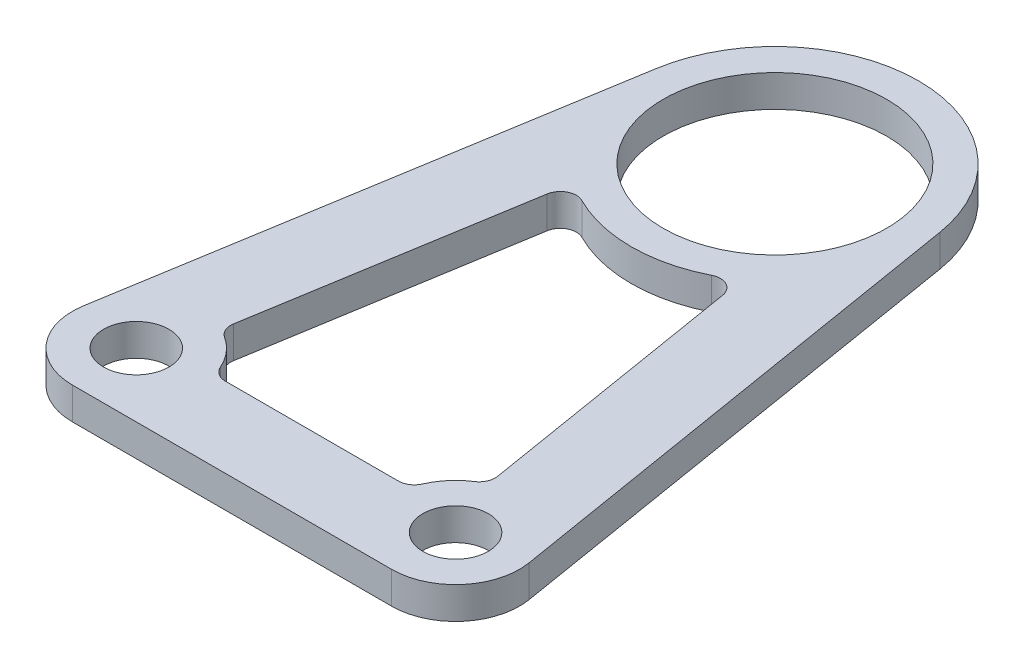
ISO-10303-21;
HEADER;
FILE_DESCRIPTION(('STEP AP214'),'2;1');
FILE_NAME('part.step','',(''),(''),'','','');
FILE_SCHEMA(('AUTOMOTIVE_DESIGN { 1 0 10303 214 1 1 1 1 }'));
ENDSEC;
DATA;
#1=APPLICATION_CONTEXT('core data for automotive mechanical design processes');
#2=APPLICATION_PROTOCOL_DEFINITION('international standard','automotive_design',2000,#1);
#3=PRODUCT_CONTEXT('',#1,'mechanical');
#4=PRODUCT('Part','Part','',(#3));
#5=PRODUCT_RELATED_PRODUCT_CATEGORY('part','',(#4));
#6=PRODUCT_DEFINITION_FORMATION('','',#4);
#7=PRODUCT_DEFINITION_CONTEXT('part definition',#1,'design');
#8=PRODUCT_DEFINITION('design','',#6,#7);
#9=PRODUCT_DEFINITION_SHAPE('','',#8);
#10=(LENGTH_UNIT() NAMED_UNIT(*) SI_UNIT(.MILLI.,.METRE.));
#11=(NAMED_UNIT(*) PLANE_ANGLE_UNIT() SI_UNIT($,.RADIAN.));
#12=(NAMED_UNIT(*) SI_UNIT($,.STERADIAN.) SOLID_ANGLE_UNIT());
#13=UNCERTAINTY_MEASURE_WITH_UNIT(LENGTH_MEASURE(1.E-05),#10,'distance_accuracy_value','');
#14=(GEOMETRIC_REPRESENTATION_CONTEXT(3) GLOBAL_UNCERTAINTY_ASSIGNED_CONTEXT((#13)) GLOBAL_UNIT_ASSIGNED_CONTEXT((#10,
#11,#12)) REPRESENTATION_CONTEXT('',''));
#15=CARTESIAN_POINT('',(0.,0.,0.));
#16=DIRECTION('',(0.,0.,1.));
#17=DIRECTION('',(1.,0.,0.));
#18=AXIS2_PLACEMENT_3D('',#15,#16,#17);
#19=CARTESIAN_POINT('',(0.,2.,0.));
#20=DIRECTION('',(0.,1.,0.));
#21=DIRECTION('',(0.,0.,1.));
#22=AXIS2_PLACEMENT_3D('',#19,#20,#21);
#23=PLANE('',#22);
#24=CARTESIAN_POINT('',(-10.,2.,30.));
#25=DIRECTION('',(0.,1.,0.));
#26=DIRECTION('',(0.,0.,1.));
#27=AXIS2_PLACEMENT_3D('',#24,#25,#26);
#28=CIRCLE('',#27,2.05);
#29=CARTESIAN_POINT('',(-10.,2.,32.05));
#30=VERTEX_POINT('',#29);
#31=EDGE_CURVE('E225',#30,#30,#28,.T.);
#32=ORIENTED_EDGE('',*,*,#31,.F.);
#33=EDGE_LOOP('',(#32));
#34=FACE_BOUND('',#33,.T.);
#35=CARTESIAN_POINT('',(0.,2.,0.));
#36=DIRECTION('',(0.,1.,0.));
#37=DIRECTION('',(0.,0.,1.));
#38=AXIS2_PLACEMENT_3D('',#35,#36,#37);
#39=CIRCLE('',#38,9.);
#40=CARTESIAN_POINT('',(8.88074729783784,2.,-1.46024909927928));
#41=VERTEX_POINT('',#40);
#42=CARTESIAN_POINT('',(-8.88074729783784,2.,-1.46024909927928));
#43=VERTEX_POINT('',#42);
#44=EDGE_CURVE('E305',#41,#43,#39,.T.);
#45=ORIENTED_EDGE('',*,*,#44,.T.);
#46=DIRECTION('',(-0.16224989991992,0.,0.98674969975976));
#47=VECTOR('',#46,1.);
#48=CARTESIAN_POINT('',(-8.88074729783784,2.,-1.46024909927928));
#49=LINE('',#48,#47);
#50=CARTESIAN_POINT('',(-13.946998799039,2.,29.3510004003203));
#51=VERTEX_POINT('',#50);
#52=EDGE_CURVE('E309',#43,#51,#49,.T.);
#53=ORIENTED_EDGE('',*,*,#52,.T.);
#54=CARTESIAN_POINT('',(-10.,2.,30.));
#55=DIRECTION('',(0.,1.,0.));
#56=DIRECTION('',(0.,0.,1.));
#57=AXIS2_PLACEMENT_3D('',#54,#55,#56);
#58=CIRCLE('',#57,4.);
#59=CARTESIAN_POINT('',(-10.,2.,34.));
#60=VERTEX_POINT('',#59);
#61=EDGE_CURVE('E313',#51,#60,#58,.T.);
#62=ORIENTED_EDGE('',*,*,#61,.T.);
#63=DIRECTION('',(1.,0.,0.));
#64=VECTOR('',#63,1.);
#65=CARTESIAN_POINT('',(-10.,2.,34.));
#66=LINE('',#65,#64);
#67=CARTESIAN_POINT('',(10.,2.,34.));
#68=VERTEX_POINT('',#67);
#69=EDGE_CURVE('E316',#60,#68,#66,.T.);
#70=ORIENTED_EDGE('',*,*,#69,.T.);
#71=CARTESIAN_POINT('',(10.,2.,30.));
#72=DIRECTION('',(0.,1.,0.));
#73=DIRECTION('',(0.,0.,-1.));
#74=AXIS2_PLACEMENT_3D('',#71,#72,#73);
#75=CIRCLE('',#74,4.);
#76=CARTESIAN_POINT('',(13.946998799039,2.,29.3510004003203));
#77=VERTEX_POINT('',#76);
#78=EDGE_CURVE('E319',#68,#77,#75,.T.);
#79=ORIENTED_EDGE('',*,*,#78,.T.);
#80=DIRECTION('',(-0.16224989991992,0.,-0.98674969975976));
#81=VECTOR('',#80,1.);
#82=CARTESIAN_POINT('',(8.88074729783784,2.,-1.46024909927928));
#83=LINE('',#82,#81);
#84=EDGE_CURVE('E322',#77,#41,#83,.T.);
#85=ORIENTED_EDGE('',*,*,#84,.T.);
#86=EDGE_LOOP('',(#45,#53,#62,#70,#79,#85));
#87=FACE_BOUND('',#86,.T.);
#88=CARTESIAN_POINT('',(0.,2.,0.));
#89=DIRECTION('',(0.,1.,0.));
#90=DIRECTION('',(0.,0.,1.));
#91=AXIS2_PLACEMENT_3D('',#88,#89,#90);
#92=CIRCLE('',#91,7.);
#93=CARTESIAN_POINT('',(0.,2.,7.));
#94=VERTEX_POINT('',#93);
#95=EDGE_CURVE('E297',#94,#94,#92,.T.);
#96=ORIENTED_EDGE('',*,*,#95,.F.);
#97=EDGE_LOOP('',(#96));
#98=FACE_BOUND('',#97,.T.);
#99=CARTESIAN_POINT('',(-10.,2.,30.));
#100=DIRECTION('',(0.,-1.,0.));
#101=DIRECTION('',(0.,0.,1.));
#102=AXIS2_PLACEMENT_3D('',#99,#100,#101);
#103=CIRCLE('',#102,4.);
#104=CARTESIAN_POINT('',(-7.82638252207875,2.,26.6421156869726));
#105=VERTEX_POINT('',#104);
#106=CARTESIAN_POINT('',(-6.33393944403533,2.,28.4));
#107=VERTEX_POINT('',#106);
#108=EDGE_CURVE('E174',#105,#107,#103,.T.);
#109=ORIENTED_EDGE('',*,*,#108,.F.);
#110=CARTESIAN_POINT('',(-7.28297815259844,2.,25.8026446087158));
#111=DIRECTION('',(0.,1.,0.));
#112=DIRECTION('',(0.,0.,1.));
#113=AXIS2_PLACEMENT_3D('',#110,#111,#112);
#114=CIRCLE('',#113,1.);
#115=CARTESIAN_POINT('',(-8.2697278523582,2.,25.6403947087959));
#116=VERTEX_POINT('',#115);
#117=EDGE_CURVE('E165',#116,#105,#114,.T.);
#118=ORIENTED_EDGE('',*,*,#117,.F.);
#119=DIRECTION('',(-0.16224989991992,0.,0.98674969975976));
#120=VECTOR('',#119,1.);
#121=CARTESIAN_POINT('',(-5.49476419863492,2.,8.76399260619268));
#122=LINE('',#121,#120);
#123=CARTESIAN_POINT('',(-5.49476419863492,2.,8.76399260619268));
#124=VERTEX_POINT('',#123);
#125=EDGE_CURVE('E220',#124,#116,#122,.T.);
#126=ORIENTED_EDGE('',*,*,#125,.F.);
#127=CARTESIAN_POINT('',(-4.50801449887516,2.,8.9262425061126));
#128=DIRECTION('',(0.,1.,0.));
#129=DIRECTION('',(0.,0.,-1.));
#130=AXIS2_PLACEMENT_3D('',#127,#128,#129);
#131=CIRCLE('',#130,1.);
#132=CARTESIAN_POINT('',(-4.05721304898764,2.,8.03361825550134));
#133=VERTEX_POINT('',#132);
#134=EDGE_CURVE('E217',#133,#124,#131,.T.);
#135=ORIENTED_EDGE('',*,*,#134,.F.);
#136=CARTESIAN_POINT('',(0.,2.,0.));
#137=DIRECTION('',(0.,-1.,0.));
#138=DIRECTION('',(0.,0.,1.));
#139=AXIS2_PLACEMENT_3D('',#136,#137,#138);
#140=CIRCLE('',#139,9.);
#141=CARTESIAN_POINT('',(4.05721304898764,2.,8.03361825550134));
#142=VERTEX_POINT('',#141);
#143=EDGE_CURVE('E214',#142,#133,#140,.T.);
#144=ORIENTED_EDGE('',*,*,#143,.F.);
#145=CARTESIAN_POINT('',(4.50801449887516,2.,8.9262425061126));
#146=DIRECTION('',(0.,1.,0.));
#147=DIRECTION('',(0.,0.,1.));
#148=AXIS2_PLACEMENT_3D('',#145,#146,#147);
#149=CIRCLE('',#148,0.999999999999999);
#150=CARTESIAN_POINT('',(5.49476419863492,2.,8.76399260619268));
#151=VERTEX_POINT('',#150);
#152=EDGE_CURVE('E211',#151,#142,#149,.T.);
#153=ORIENTED_EDGE('',*,*,#152,.F.);
#154=DIRECTION('',(-0.16224989991992,0.,-0.98674969975976));
#155=VECTOR('',#154,1.);
#156=CARTESIAN_POINT('',(5.49476419863492,2.,8.76399260619268));
#157=LINE('',#156,#155);
#158=CARTESIAN_POINT('',(8.2697278523582,2.,25.6403947087959));
#159=VERTEX_POINT('',#158);
#160=EDGE_CURVE('E208',#159,#151,#157,.T.);
#161=ORIENTED_EDGE('',*,*,#160,.F.);
#162=CARTESIAN_POINT('',(7.28297815259844,2.,25.8026446087158));
#163=DIRECTION('',(0.,1.,0.));
#164=DIRECTION('',(0.,0.,-1.));
#165=AXIS2_PLACEMENT_3D('',#162,#163,#164);
#166=CIRCLE('',#165,1.);
#167=CARTESIAN_POINT('',(7.82638252207876,2.,26.6421156869726));
#168=VERTEX_POINT('',#167);
#169=EDGE_CURVE('E205',#168,#159,#166,.T.);
#170=ORIENTED_EDGE('',*,*,#169,.F.);
#171=CARTESIAN_POINT('',(10.,2.,30.));
#172=DIRECTION('',(0.,-1.,0.));
#173=DIRECTION('',(0.,0.,-1.));
#174=AXIS2_PLACEMENT_3D('',#171,#172,#173);
#175=CIRCLE('',#174,4.);
#176=CARTESIAN_POINT('',(6.33393944403534,2.,28.4));
#177=VERTEX_POINT('',#176);
#178=EDGE_CURVE('E202',#177,#168,#175,.T.);
#179=ORIENTED_EDGE('',*,*,#178,.F.);
#180=CARTESIAN_POINT('',(5.41742430504417,2.,28.));
#181=DIRECTION('',(0.,1.,0.));
#182=DIRECTION('',(0.,0.,1.));
#183=AXIS2_PLACEMENT_3D('',#180,#181,#182);
#184=CIRCLE('',#183,1.);
#185=CARTESIAN_POINT('',(5.41742430504417,2.,29.));
#186=VERTEX_POINT('',#185);
#187=EDGE_CURVE('E199',#186,#177,#184,.T.);
#188=ORIENTED_EDGE('',*,*,#187,.F.);
#189=DIRECTION('',(1.,0.,0.));
#190=VECTOR('',#189,1.);
#191=CARTESIAN_POINT('',(-5.41742430504416,2.,29.));
#192=LINE('',#191,#190);
#193=CARTESIAN_POINT('',(-5.41742430504416,2.,29.));
#194=VERTEX_POINT('',#193);
#195=EDGE_CURVE('E193',#194,#186,#192,.T.);
#196=ORIENTED_EDGE('',*,*,#195,.F.);
#197=CARTESIAN_POINT('',(-5.41742430504416,2.,28.));
#198=DIRECTION('',(0.,1.,0.));
#199=DIRECTION('',(0.,0.,-1.));
#200=AXIS2_PLACEMENT_3D('',#197,#198,#199);
#201=CIRCLE('',#200,1.);
#202=EDGE_CURVE('E189',#107,#194,#201,.T.);
#203=ORIENTED_EDGE('',*,*,#202,.F.);
#204=EDGE_LOOP('',(#109,#118,#126,#135,#144,#153,#161,#170,#179,#188,#196,#203));
#205=FACE_BOUND('',#204,.T.);
#206=CARTESIAN_POINT('',(10.,2.,30.));
#207=DIRECTION('',(0.,1.,0.));
#208=DIRECTION('',(0.,0.,-1.));
#209=AXIS2_PLACEMENT_3D('',#206,#207,#208);
#210=CIRCLE('',#209,2.05);
#211=CARTESIAN_POINT('',(10.,2.,27.95));
#212=VERTEX_POINT('',#211);
#213=EDGE_CURVE('E466',#212,#212,#210,.T.);
#214=ORIENTED_EDGE('',*,*,#213,.F.);
#215=EDGE_LOOP('',(#214));
#216=FACE_BOUND('',#215,.T.);
#217=ADVANCED_FACE('F39',(#34,#87,#98,#205,#216),#23,.T.);
#218=CARTESIAN_POINT('',(0.,0.,0.));
#219=DIRECTION('',(0.,1.,0.));
#220=DIRECTION('',(0.,0.,1.));
#221=AXIS2_PLACEMENT_3D('',#218,#219,#220);
#222=PLANE('',#221);
#223=CARTESIAN_POINT('',(0.,0.,0.));
#224=DIRECTION('',(0.,1.,0.));
#225=DIRECTION('',(0.,0.,1.));
#226=AXIS2_PLACEMENT_3D('',#223,#224,#225);
#227=CIRCLE('',#226,7.);
#228=CARTESIAN_POINT('',(0.,0.,7.));
#229=VERTEX_POINT('',#228);
#230=EDGE_CURVE('E183',#229,#229,#227,.T.);
#231=ORIENTED_EDGE('',*,*,#230,.T.);
#232=EDGE_LOOP('',(#231));
#233=FACE_BOUND('',#232,.T.);
#234=CARTESIAN_POINT('',(0.,0.,0.));
#235=DIRECTION('',(0.,1.,0.));
#236=DIRECTION('',(0.,0.,1.));
#237=AXIS2_PLACEMENT_3D('',#234,#235,#236);
#238=CIRCLE('',#237,9.);
#239=CARTESIAN_POINT('',(8.88074729783784,0.,-1.46024909927928));
#240=VERTEX_POINT('',#239);
#241=CARTESIAN_POINT('',(-8.88074729783784,0.,-1.46024909927928));
#242=VERTEX_POINT('',#241);
#243=EDGE_CURVE('E301',#240,#242,#238,.T.);
#244=ORIENTED_EDGE('',*,*,#243,.F.);
#245=DIRECTION('',(-0.16224989991992,0.,-0.98674969975976));
#246=VECTOR('',#245,1.);
#247=CARTESIAN_POINT('',(8.88074729783784,0.,-1.46024909927928));
#248=LINE('',#247,#246);
#249=CARTESIAN_POINT('',(13.946998799039,0.,29.3510004003203));
#250=VERTEX_POINT('',#249);
#251=EDGE_CURVE('E310',#250,#240,#248,.T.);
#252=ORIENTED_EDGE('',*,*,#251,.F.);
#253=CARTESIAN_POINT('',(10.,0.,30.));
#254=DIRECTION('',(0.,1.,0.));
#255=DIRECTION('',(0.,0.,-1.));
#256=AXIS2_PLACEMENT_3D('',#253,#254,#255);
#257=CIRCLE('',#256,4.);
#258=CARTESIAN_POINT('',(10.,0.,34.));
#259=VERTEX_POINT('',#258);
#260=EDGE_CURVE('E338',#259,#250,#257,.T.);
#261=ORIENTED_EDGE('',*,*,#260,.F.);
#262=DIRECTION('',(1.,0.,0.));
#263=VECTOR('',#262,1.);
#264=CARTESIAN_POINT('',(-10.,0.,34.));
#265=LINE('',#264,#263);
#266=CARTESIAN_POINT('',(-10.,0.,34.));
#267=VERTEX_POINT('',#266);
#268=EDGE_CURVE('E335',#267,#259,#265,.T.);
#269=ORIENTED_EDGE('',*,*,#268,.F.);
#270=CARTESIAN_POINT('',(-10.,0.,30.));
#271=DIRECTION('',(0.,1.,0.));
#272=DIRECTION('',(0.,0.,1.));
#273=AXIS2_PLACEMENT_3D('',#270,#271,#272);
#274=CIRCLE('',#273,4.);
#275=CARTESIAN_POINT('',(-13.946998799039,0.,29.3510004003203));
#276=VERTEX_POINT('',#275);
#277=EDGE_CURVE('E332',#276,#267,#274,.T.);
#278=ORIENTED_EDGE('',*,*,#277,.F.);
#279=DIRECTION('',(-0.16224989991992,0.,0.98674969975976));
#280=VECTOR('',#279,1.);
#281=CARTESIAN_POINT('',(-8.88074729783784,0.,-1.46024909927928));
#282=LINE('',#281,#280);
#283=EDGE_CURVE('E329',#242,#276,#282,.T.);
#284=ORIENTED_EDGE('',*,*,#283,.F.);
#285=EDGE_LOOP('',(#244,#252,#261,#269,#278,#284));
#286=FACE_BOUND('',#285,.T.);
#287=CARTESIAN_POINT('',(-7.28297815259844,0.,25.8026446087158));
#288=DIRECTION('',(0.,1.,0.));
#289=DIRECTION('',(0.,0.,1.));
#290=AXIS2_PLACEMENT_3D('',#287,#288,#289);
#291=CIRCLE('',#290,1.);
#292=CARTESIAN_POINT('',(-8.2697278523582,0.,25.6403947087959));
#293=VERTEX_POINT('',#292);
#294=CARTESIAN_POINT('',(-7.82638252207875,0.,26.6421156869726));
#295=VERTEX_POINT('',#294);
#296=EDGE_CURVE('E63',#293,#295,#291,.T.);
#297=ORIENTED_EDGE('',*,*,#296,.T.);
#298=CARTESIAN_POINT('',(-10.,0.,30.));
#299=DIRECTION('',(0.,-1.,0.));
#300=DIRECTION('',(0.,0.,1.));
#301=AXIS2_PLACEMENT_3D('',#298,#299,#300);
#302=CIRCLE('',#301,4.);
#303=CARTESIAN_POINT('',(-6.33393944403533,0.,28.4));
#304=VERTEX_POINT('',#303);
#305=EDGE_CURVE('E181',#295,#304,#302,.T.);
#306=ORIENTED_EDGE('',*,*,#305,.T.);
#307=CARTESIAN_POINT('',(-5.41742430504416,0.,28.));
#308=DIRECTION('',(0.,1.,0.));
#309=DIRECTION('',(0.,0.,-1.));
#310=AXIS2_PLACEMENT_3D('',#307,#308,#309);
#311=CIRCLE('',#310,1.);
#312=CARTESIAN_POINT('',(-5.41742430504416,0.,29.));
#313=VERTEX_POINT('',#312);
#314=EDGE_CURVE('E228',#304,#313,#311,.T.);
#315=ORIENTED_EDGE('',*,*,#314,.T.);
#316=DIRECTION('',(1.,0.,0.));
#317=VECTOR('',#316,1.);
#318=CARTESIAN_POINT('',(-5.41742430504416,0.,29.));
#319=LINE('',#318,#317);
#320=CARTESIAN_POINT('',(5.41742430504417,0.,29.));
#321=VERTEX_POINT('',#320);
#322=EDGE_CURVE('E232',#313,#321,#319,.T.);
#323=ORIENTED_EDGE('',*,*,#322,.T.);
#324=CARTESIAN_POINT('',(5.41742430504417,0.,28.));
#325=DIRECTION('',(0.,1.,0.));
#326=DIRECTION('',(0.,0.,1.));
#327=AXIS2_PLACEMENT_3D('',#324,#325,#326);
#328=CIRCLE('',#327,1.);
#329=CARTESIAN_POINT('',(6.33393944403534,0.,28.4));
#330=VERTEX_POINT('',#329);
#331=EDGE_CURVE('E236',#321,#330,#328,.T.);
#332=ORIENTED_EDGE('',*,*,#331,.T.);
#333=CARTESIAN_POINT('',(10.,0.,30.));
#334=DIRECTION('',(0.,-1.,0.));
#335=DIRECTION('',(0.,0.,-1.));
#336=AXIS2_PLACEMENT_3D('',#333,#334,#335);
#337=CIRCLE('',#336,4.);
#338=CARTESIAN_POINT('',(7.82638252207876,0.,26.6421156869726));
#339=VERTEX_POINT('',#338);
#340=EDGE_CURVE('E240',#330,#339,#337,.T.);
#341=ORIENTED_EDGE('',*,*,#340,.T.);
#342=CARTESIAN_POINT('',(7.28297815259844,0.,25.8026446087158));
#343=DIRECTION('',(0.,1.,0.));
#344=DIRECTION('',(0.,0.,-1.));
#345=AXIS2_PLACEMENT_3D('',#342,#343,#344);
#346=CIRCLE('',#345,1.);
#347=CARTESIAN_POINT('',(8.2697278523582,0.,25.6403947087959));
#348=VERTEX_POINT('',#347);
#349=EDGE_CURVE('E244',#339,#348,#346,.T.);
#350=ORIENTED_EDGE('',*,*,#349,.T.);
#351=DIRECTION('',(-0.16224989991992,0.,-0.98674969975976));
#352=VECTOR('',#351,1.);
#353=CARTESIAN_POINT('',(5.49476419863492,0.,8.76399260619268));
#354=LINE('',#353,#352);
#355=CARTESIAN_POINT('',(5.49476419863492,0.,8.76399260619268));
#356=VERTEX_POINT('',#355);
#357=EDGE_CURVE('E248',#348,#356,#354,.T.);
#358=ORIENTED_EDGE('',*,*,#357,.T.);
#359=CARTESIAN_POINT('',(4.50801449887516,0.,8.9262425061126));
#360=DIRECTION('',(0.,1.,0.));
#361=DIRECTION('',(0.,0.,1.));
#362=AXIS2_PLACEMENT_3D('',#359,#360,#361);
#363=CIRCLE('',#362,0.999999999999999);
#364=CARTESIAN_POINT('',(4.05721304898764,0.,8.03361825550134));
#365=VERTEX_POINT('',#364);
#366=EDGE_CURVE('E252',#356,#365,#363,.T.);
#367=ORIENTED_EDGE('',*,*,#366,.T.);
#368=CARTESIAN_POINT('',(0.,0.,0.));
#369=DIRECTION('',(0.,-1.,0.));
#370=DIRECTION('',(0.,0.,1.));
#371=AXIS2_PLACEMENT_3D('',#368,#369,#370);
#372=CIRCLE('',#371,9.);
#373=CARTESIAN_POINT('',(-4.05721304898764,0.,8.03361825550134));
#374=VERTEX_POINT('',#373);
#375=EDGE_CURVE('E256',#365,#374,#372,.T.);
#376=ORIENTED_EDGE('',*,*,#375,.T.);
#377=CARTESIAN_POINT('',(-4.50801449887516,0.,8.9262425061126));
#378=DIRECTION('',(0.,1.,0.));
#379=DIRECTION('',(0.,0.,-1.));
#380=AXIS2_PLACEMENT_3D('',#377,#378,#379);
#381=CIRCLE('',#380,1.);
#382=CARTESIAN_POINT('',(-5.49476419863492,0.,8.76399260619268));
#383=VERTEX_POINT('',#382);
#384=EDGE_CURVE('E260',#374,#383,#381,.T.);
#385=ORIENTED_EDGE('',*,*,#384,.T.);
#386=DIRECTION('',(-0.16224989991992,0.,0.98674969975976));
#387=VECTOR('',#386,1.);
#388=CARTESIAN_POINT('',(-5.49476419863492,0.,8.76399260619268));
#389=LINE('',#388,#387);
#390=EDGE_CURVE('E175',#383,#293,#389,.T.);
#391=ORIENTED_EDGE('',*,*,#390,.T.);
#392=EDGE_LOOP('',(#297,#306,#315,#323,#332,#341,#350,#358,#367,#376,#385,#391));
#393=FACE_BOUND('',#392,.T.);
#394=CARTESIAN_POINT('',(-10.,0.,30.));
#395=DIRECTION('',(0.,1.,0.));
#396=DIRECTION('',(0.,0.,1.));
#397=AXIS2_PLACEMENT_3D('',#394,#395,#396);
#398=CIRCLE('',#397,2.05);
#399=CARTESIAN_POINT('',(-10.,0.,32.05));
#400=VERTEX_POINT('',#399);
#401=EDGE_CURVE('E474',#400,#400,#398,.T.);
#402=ORIENTED_EDGE('',*,*,#401,.T.);
#403=EDGE_LOOP('',(#402));
#404=FACE_BOUND('',#403,.T.);
#405=CARTESIAN_POINT('',(10.,0.,30.));
#406=DIRECTION('',(0.,1.,0.));
#407=DIRECTION('',(0.,0.,-1.));
#408=AXIS2_PLACEMENT_3D('',#405,#406,#407);
#409=CIRCLE('',#408,2.05);
#410=CARTESIAN_POINT('',(10.,0.,27.95));
#411=VERTEX_POINT('',#410);
#412=EDGE_CURVE('E469',#411,#411,#409,.T.);
#413=ORIENTED_EDGE('',*,*,#412,.T.);
#414=EDGE_LOOP('',(#413));
#415=FACE_BOUND('',#414,.T.);
#416=ADVANCED_FACE('F369',(#233,#286,#393,#404,#415),#222,.F.);
#417=CARTESIAN_POINT('',(0.,2.,0.));
#418=DIRECTION('',(0.,-1.,0.));
#419=DIRECTION('',(0.,0.,-1.));
#420=AXIS2_PLACEMENT_3D('',#417,#418,#419);
#421=CYLINDRICAL_SURFACE('',#420,9.);
#422=ORIENTED_EDGE('',*,*,#243,.T.);
#423=DIRECTION('',(0.,-1.,0.));
#424=VECTOR('',#423,1.);
#425=CARTESIAN_POINT('',(-8.88074729783784,2.,-1.46024909927928));
#426=LINE('',#425,#424);
#427=EDGE_CURVE('E11',#43,#242,#426,.T.);
#428=ORIENTED_EDGE('',*,*,#427,.F.);
#429=ORIENTED_EDGE('',*,*,#44,.F.);
#430=DIRECTION('',(0.,-1.,0.));
#431=VECTOR('',#430,1.);
#432=CARTESIAN_POINT('',(8.88074729783784,2.,-1.46024909927928));
#433=LINE('',#432,#431);
#434=EDGE_CURVE('E325',#41,#240,#433,.T.);
#435=ORIENTED_EDGE('',*,*,#434,.T.);
#436=EDGE_LOOP('',(#422,#428,#429,#435));
#437=FACE_BOUND('',#436,.T.);
#438=ADVANCED_FACE('F41',(#437),#421,.T.);
#439=CARTESIAN_POINT('',(-8.88074729783784,2.,-1.46024909927928));
#440=DIRECTION('',(0.98674969975976,0.,0.16224989991992));
#441=DIRECTION('',(0.16224989991992,0.,-0.98674969975976));
#442=AXIS2_PLACEMENT_3D('',#439,#440,#441);
#443=PLANE('',#442);
#444=ORIENTED_EDGE('',*,*,#283,.T.);
#445=DIRECTION('',(0.,-1.,0.));
#446=VECTOR('',#445,1.);
#447=CARTESIAN_POINT('',(-13.946998799039,2.,29.3510004003203));
#448=LINE('',#447,#446);
#449=EDGE_CURVE('E48',#51,#276,#448,.T.);
#450=ORIENTED_EDGE('',*,*,#449,.F.);
#451=ORIENTED_EDGE('',*,*,#52,.F.);
#452=ORIENTED_EDGE('',*,*,#427,.T.);
#453=EDGE_LOOP('',(#444,#450,#451,#452));
#454=FACE_BOUND('',#453,.T.);
#455=ADVANCED_FACE('F387',(#454),#443,.F.);
#456=CARTESIAN_POINT('',(-10.,2.,30.));
#457=DIRECTION('',(0.,-1.,0.));
#458=DIRECTION('',(0.,0.,-1.));
#459=AXIS2_PLACEMENT_3D('',#456,#457,#458);
#460=CYLINDRICAL_SURFACE('',#459,4.);
#461=ORIENTED_EDGE('',*,*,#277,.T.);
#462=DIRECTION('',(0.,-1.,0.));
#463=VECTOR('',#462,1.);
#464=CARTESIAN_POINT('',(-10.,2.,34.));
#465=LINE('',#464,#463);
#466=EDGE_CURVE('E354',#60,#267,#465,.T.);
#467=ORIENTED_EDGE('',*,*,#466,.F.);
#468=ORIENTED_EDGE('',*,*,#61,.F.);
#469=ORIENTED_EDGE('',*,*,#449,.T.);
#470=EDGE_LOOP('',(#461,#467,#468,#469));
#471=FACE_BOUND('',#470,.T.);
#472=ADVANCED_FACE('F363',(#471),#460,.T.);
#473=CARTESIAN_POINT('',(-10.,2.,34.));
#474=DIRECTION('',(0.,0.,-1.));
#475=DIRECTION('',(-1.,0.,0.));
#476=AXIS2_PLACEMENT_3D('',#473,#474,#475);
#477=PLANE('',#476);
#478=ORIENTED_EDGE('',*,*,#268,.T.);
#479=DIRECTION('',(0.,-1.,0.));
#480=VECTOR('',#479,1.);
#481=CARTESIAN_POINT('',(10.,2.,34.));
#482=LINE('',#481,#480);
#483=EDGE_CURVE('E350',#68,#259,#482,.T.);
#484=ORIENTED_EDGE('',*,*,#483,.F.);
#485=ORIENTED_EDGE('',*,*,#69,.F.);
#486=ORIENTED_EDGE('',*,*,#466,.T.);
#487=EDGE_LOOP('',(#478,#484,#485,#486));
#488=FACE_BOUND('',#487,.T.);
#489=ADVANCED_FACE('F375',(#488),#477,.F.);
#490=CARTESIAN_POINT('',(10.,2.,30.));
#491=DIRECTION('',(0.,-1.,0.));
#492=DIRECTION('',(0.,0.,-1.));
#493=AXIS2_PLACEMENT_3D('',#490,#491,#492);
#494=CYLINDRICAL_SURFACE('',#493,4.);
#495=ORIENTED_EDGE('',*,*,#260,.T.);
#496=DIRECTION('',(0.,-1.,0.));
#497=VECTOR('',#496,1.);
#498=CARTESIAN_POINT('',(13.946998799039,2.,29.3510004003203));
#499=LINE('',#498,#497);
#500=EDGE_CURVE('E346',#77,#250,#499,.T.);
#501=ORIENTED_EDGE('',*,*,#500,.F.);
#502=ORIENTED_EDGE('',*,*,#78,.F.);
#503=ORIENTED_EDGE('',*,*,#483,.T.);
#504=EDGE_LOOP('',(#495,#501,#502,#503));
#505=FACE_BOUND('',#504,.T.);
#506=ADVANCED_FACE('F379',(#505),#494,.T.);
#507=CARTESIAN_POINT('',(8.88074729783784,2.,-1.46024909927928));
#508=DIRECTION('',(-0.98674969975976,0.,0.16224989991992));
#509=DIRECTION('',(0.16224989991992,0.,0.98674969975976));
#510=AXIS2_PLACEMENT_3D('',#507,#508,#509);
#511=PLANE('',#510);
#512=ORIENTED_EDGE('',*,*,#251,.T.);
#513=ORIENTED_EDGE('',*,*,#434,.F.);
#514=ORIENTED_EDGE('',*,*,#84,.F.);
#515=ORIENTED_EDGE('',*,*,#500,.T.);
#516=EDGE_LOOP('',(#512,#513,#514,#515));
#517=FACE_BOUND('',#516,.T.);
#518=ADVANCED_FACE('F390',(#517),#511,.F.);
#519=CARTESIAN_POINT('',(0.,2.,0.));
#520=DIRECTION('',(0.,-1.,0.));
#521=DIRECTION('',(0.,0.,-1.));
#522=AXIS2_PLACEMENT_3D('',#519,#520,#521);
#523=CYLINDRICAL_SURFACE('',#522,7.);
#524=ORIENTED_EDGE('',*,*,#95,.T.);
#525=EDGE_LOOP('',(#524));
#526=FACE_BOUND('',#525,.T.);
#527=ORIENTED_EDGE('',*,*,#230,.F.);
#528=EDGE_LOOP('',(#527));
#529=FACE_BOUND('',#528,.T.);
#530=ADVANCED_FACE('F392',(#526,#529),#523,.F.);
#531=CARTESIAN_POINT('',(-7.28297815259844,2.,25.8026446087158));
#532=DIRECTION('',(0.,-1.,0.));
#533=DIRECTION('',(0.,0.,-1.));
#534=AXIS2_PLACEMENT_3D('',#531,#532,#533);
#535=CYLINDRICAL_SURFACE('',#534,1.);
#536=ORIENTED_EDGE('',*,*,#296,.F.);
#537=DIRECTION('',(0.,-1.,0.));
#538=VECTOR('',#537,1.);
#539=CARTESIAN_POINT('',(-8.2697278523582,2.,25.6403947087959));
#540=LINE('',#539,#538);
#541=EDGE_CURVE('E169',#116,#293,#540,.T.);
#542=ORIENTED_EDGE('',*,*,#541,.F.);
#543=ORIENTED_EDGE('',*,*,#117,.T.);
#544=DIRECTION('',(0.,-1.,0.));
#545=VECTOR('',#544,1.);
#546=CARTESIAN_POINT('',(-7.82638252207875,2.,26.6421156869726));
#547=LINE('',#546,#545);
#548=EDGE_CURVE('E168',#105,#295,#547,.T.);
#549=ORIENTED_EDGE('',*,*,#548,.T.);
#550=EDGE_LOOP('',(#536,#542,#543,#549));
#551=FACE_BOUND('',#550,.T.);
#552=ADVANCED_FACE('F167',(#551),#535,.F.);
#553=CARTESIAN_POINT('',(-10.,2.,30.));
#554=DIRECTION('',(0.,-1.,0.));
#555=DIRECTION('',(0.,0.,-1.));
#556=AXIS2_PLACEMENT_3D('',#553,#554,#555);
#557=CYLINDRICAL_SURFACE('',#556,4.);
#558=ORIENTED_EDGE('',*,*,#305,.F.);
#559=ORIENTED_EDGE('',*,*,#548,.F.);
#560=ORIENTED_EDGE('',*,*,#108,.T.);
#561=DIRECTION('',(0.,-1.,0.));
#562=VECTOR('',#561,1.);
#563=CARTESIAN_POINT('',(-6.33393944403533,2.,28.4));
#564=LINE('',#563,#562);
#565=EDGE_CURVE('E184',#107,#304,#564,.T.);
#566=ORIENTED_EDGE('',*,*,#565,.T.);
#567=EDGE_LOOP('',(#558,#559,#560,#566));
#568=FACE_BOUND('',#567,.T.);
#569=ADVANCED_FACE('F178',(#568),#557,.T.);
#570=CARTESIAN_POINT('',(-5.41742430504416,2.,28.));
#571=DIRECTION('',(0.,-1.,0.));
#572=DIRECTION('',(0.,0.,-1.));
#573=AXIS2_PLACEMENT_3D('',#570,#571,#572);
#574=CYLINDRICAL_SURFACE('',#573,1.);
#575=ORIENTED_EDGE('',*,*,#314,.F.);
#576=ORIENTED_EDGE('',*,*,#565,.F.);
#577=ORIENTED_EDGE('',*,*,#202,.T.);
#578=DIRECTION('',(0.,-1.,0.));
#579=VECTOR('',#578,1.);
#580=CARTESIAN_POINT('',(-5.41742430504416,2.,29.));
#581=LINE('',#580,#579);
#582=EDGE_CURVE('E292',#194,#313,#581,.T.);
#583=ORIENTED_EDGE('',*,*,#582,.T.);
#584=EDGE_LOOP('',(#575,#576,#577,#583));
#585=FACE_BOUND('',#584,.T.);
#586=ADVANCED_FACE('F415',(#585),#574,.F.);
#587=CARTESIAN_POINT('',(-5.41742430504416,2.,29.));
#588=DIRECTION('',(0.,0.,-1.));
#589=DIRECTION('',(-1.,0.,0.));
#590=AXIS2_PLACEMENT_3D('',#587,#588,#589);
#591=PLANE('',#590);
#592=ORIENTED_EDGE('',*,*,#322,.F.);
#593=ORIENTED_EDGE('',*,*,#582,.F.);
#594=ORIENTED_EDGE('',*,*,#195,.T.);
#595=DIRECTION('',(0.,-1.,0.));
#596=VECTOR('',#595,1.);
#597=CARTESIAN_POINT('',(5.41742430504417,2.,29.));
#598=LINE('',#597,#596);
#599=EDGE_CURVE('E289',#186,#321,#598,.T.);
#600=ORIENTED_EDGE('',*,*,#599,.T.);
#601=EDGE_LOOP('',(#592,#593,#594,#600));
#602=FACE_BOUND('',#601,.T.);
#603=ADVANCED_FACE('F418',(#602),#591,.T.);
#604=CARTESIAN_POINT('',(5.41742430504417,2.,28.));
#605=DIRECTION('',(0.,-1.,0.));
#606=DIRECTION('',(0.,0.,-1.));
#607=AXIS2_PLACEMENT_3D('',#604,#605,#606);
#608=CYLINDRICAL_SURFACE('',#607,1.);
#609=ORIENTED_EDGE('',*,*,#331,.F.);
#610=ORIENTED_EDGE('',*,*,#599,.F.);
#611=ORIENTED_EDGE('',*,*,#187,.T.);
#612=DIRECTION('',(0.,-1.,0.));
#613=VECTOR('',#612,1.);
#614=CARTESIAN_POINT('',(6.33393944403534,2.,28.4));
#615=LINE('',#614,#613);
#616=EDGE_CURVE('E286',#177,#330,#615,.T.);
#617=ORIENTED_EDGE('',*,*,#616,.T.);
#618=EDGE_LOOP('',(#609,#610,#611,#617));
#619=FACE_BOUND('',#618,.T.);
#620=ADVANCED_FACE('F422',(#619),#608,.F.);
#621=CARTESIAN_POINT('',(10.,2.,30.));
#622=DIRECTION('',(0.,-1.,0.));
#623=DIRECTION('',(0.,0.,-1.));
#624=AXIS2_PLACEMENT_3D('',#621,#622,#623);
#625=CYLINDRICAL_SURFACE('',#624,4.);
#626=ORIENTED_EDGE('',*,*,#340,.F.);
#627=ORIENTED_EDGE('',*,*,#616,.F.);
#628=ORIENTED_EDGE('',*,*,#178,.T.);
#629=DIRECTION('',(0.,-1.,0.));
#630=VECTOR('',#629,1.);
#631=CARTESIAN_POINT('',(7.82638252207876,2.,26.6421156869726));
#632=LINE('',#631,#630);
#633=EDGE_CURVE('E283',#168,#339,#632,.T.);
#634=ORIENTED_EDGE('',*,*,#633,.T.);
#635=EDGE_LOOP('',(#626,#627,#628,#634));
#636=FACE_BOUND('',#635,.T.);
#637=ADVANCED_FACE('F426',(#636),#625,.T.);
#638=CARTESIAN_POINT('',(7.28297815259844,2.,25.8026446087158));
#639=DIRECTION('',(0.,-1.,0.));
#640=DIRECTION('',(0.,0.,-1.));
#641=AXIS2_PLACEMENT_3D('',#638,#639,#640);
#642=CYLINDRICAL_SURFACE('',#641,1.);
#643=ORIENTED_EDGE('',*,*,#349,.F.);
#644=ORIENTED_EDGE('',*,*,#633,.F.);
#645=ORIENTED_EDGE('',*,*,#169,.T.);
#646=DIRECTION('',(0.,-1.,0.));
#647=VECTOR('',#646,1.);
#648=CARTESIAN_POINT('',(8.2697278523582,2.,25.6403947087959));
#649=LINE('',#648,#647);
#650=EDGE_CURVE('E280',#159,#348,#649,.T.);
#651=ORIENTED_EDGE('',*,*,#650,.T.);
#652=EDGE_LOOP('',(#643,#644,#645,#651));
#653=FACE_BOUND('',#652,.T.);
#654=ADVANCED_FACE('F430',(#653),#642,.F.);
#655=CARTESIAN_POINT('',(5.49476419863492,2.,8.76399260619268));
#656=DIRECTION('',(-0.98674969975976,0.,0.16224989991992));
#657=DIRECTION('',(0.16224989991992,0.,0.98674969975976));
#658=AXIS2_PLACEMENT_3D('',#655,#656,#657);
#659=PLANE('',#658);
#660=ORIENTED_EDGE('',*,*,#357,.F.);
#661=ORIENTED_EDGE('',*,*,#650,.F.);
#662=ORIENTED_EDGE('',*,*,#160,.T.);
#663=DIRECTION('',(0.,-1.,0.));
#664=VECTOR('',#663,1.);
#665=CARTESIAN_POINT('',(5.49476419863492,2.,8.76399260619268));
#666=LINE('',#665,#664);
#667=EDGE_CURVE('E277',#151,#356,#666,.T.);
#668=ORIENTED_EDGE('',*,*,#667,.T.);
#669=EDGE_LOOP('',(#660,#661,#662,#668));
#670=FACE_BOUND('',#669,.T.);
#671=ADVANCED_FACE('F434',(#670),#659,.T.);
#672=CARTESIAN_POINT('',(4.50801449887516,2.,8.9262425061126));
#673=DIRECTION('',(0.,-1.,0.));
#674=DIRECTION('',(0.,0.,-1.));
#675=AXIS2_PLACEMENT_3D('',#672,#673,#674);
#676=CYLINDRICAL_SURFACE('',#675,0.999999999999999);
#677=ORIENTED_EDGE('',*,*,#366,.F.);
#678=ORIENTED_EDGE('',*,*,#667,.F.);
#679=ORIENTED_EDGE('',*,*,#152,.T.);
#680=DIRECTION('',(0.,-1.,0.));
#681=VECTOR('',#680,1.);
#682=CARTESIAN_POINT('',(4.05721304898764,2.,8.03361825550134));
#683=LINE('',#682,#681);
#684=EDGE_CURVE('E274',#142,#365,#683,.T.);
#685=ORIENTED_EDGE('',*,*,#684,.T.);
#686=EDGE_LOOP('',(#677,#678,#679,#685));
#687=FACE_BOUND('',#686,.T.);
#688=ADVANCED_FACE('F438',(#687),#676,.F.);
#689=CARTESIAN_POINT('',(0.,2.,0.));
#690=DIRECTION('',(0.,-1.,0.));
#691=DIRECTION('',(0.,0.,-1.));
#692=AXIS2_PLACEMENT_3D('',#689,#690,#691);
#693=CYLINDRICAL_SURFACE('',#692,9.);
#694=ORIENTED_EDGE('',*,*,#375,.F.);
#695=ORIENTED_EDGE('',*,*,#684,.F.);
#696=ORIENTED_EDGE('',*,*,#143,.T.);
#697=DIRECTION('',(0.,-1.,0.));
#698=VECTOR('',#697,1.);
#699=CARTESIAN_POINT('',(-4.05721304898764,2.,8.03361825550134));
#700=LINE('',#699,#698);
#701=EDGE_CURVE('E271',#133,#374,#700,.T.);
#702=ORIENTED_EDGE('',*,*,#701,.T.);
#703=EDGE_LOOP('',(#694,#695,#696,#702));
#704=FACE_BOUND('',#703,.T.);
#705=ADVANCED_FACE('F442',(#704),#693,.T.);
#706=CARTESIAN_POINT('',(-4.50801449887516,2.,8.9262425061126));
#707=DIRECTION('',(0.,-1.,0.));
#708=DIRECTION('',(0.,0.,-1.));
#709=AXIS2_PLACEMENT_3D('',#706,#707,#708);
#710=CYLINDRICAL_SURFACE('',#709,1.);
#711=ORIENTED_EDGE('',*,*,#384,.F.);
#712=ORIENTED_EDGE('',*,*,#701,.F.);
#713=ORIENTED_EDGE('',*,*,#134,.T.);
#714=DIRECTION('',(0.,-1.,0.));
#715=VECTOR('',#714,1.);
#716=CARTESIAN_POINT('',(-5.49476419863492,2.,8.76399260619268));
#717=LINE('',#716,#715);
#718=EDGE_CURVE('E55',#124,#383,#717,.T.);
#719=ORIENTED_EDGE('',*,*,#718,.T.);
#720=EDGE_LOOP('',(#711,#712,#713,#719));
#721=FACE_BOUND('',#720,.T.);
#722=ADVANCED_FACE('F446',(#721),#710,.F.);
#723=CARTESIAN_POINT('',(-5.49476419863492,2.,8.76399260619268));
#724=DIRECTION('',(0.98674969975976,0.,0.16224989991992));
#725=DIRECTION('',(0.16224989991992,0.,-0.98674969975976));
#726=AXIS2_PLACEMENT_3D('',#723,#724,#725);
#727=PLANE('',#726);
#728=ORIENTED_EDGE('',*,*,#390,.F.);
#729=ORIENTED_EDGE('',*,*,#718,.F.);
#730=ORIENTED_EDGE('',*,*,#125,.T.);
#731=ORIENTED_EDGE('',*,*,#541,.T.);
#732=EDGE_LOOP('',(#728,#729,#730,#731));
#733=FACE_BOUND('',#732,.T.);
#734=ADVANCED_FACE('F450',(#733),#727,.T.);
#735=CARTESIAN_POINT('',(-10.,2.,30.));
#736=DIRECTION('',(0.,-1.,0.));
#737=DIRECTION('',(0.,0.,-1.));
#738=AXIS2_PLACEMENT_3D('',#735,#736,#737);
#739=CYLINDRICAL_SURFACE('',#738,2.05);
#740=ORIENTED_EDGE('',*,*,#31,.T.);
#741=EDGE_LOOP('',(#740));
#742=FACE_BOUND('',#741,.T.);
#743=ORIENTED_EDGE('',*,*,#401,.F.);
#744=EDGE_LOOP('',(#743));
#745=FACE_BOUND('',#744,.T.);
#746=ADVANCED_FACE('F454',(#742,#745),#739,.F.);
#747=CARTESIAN_POINT('',(10.,2.,30.));
#748=DIRECTION('',(0.,-1.,0.));
#749=DIRECTION('',(0.,0.,-1.));
#750=AXIS2_PLACEMENT_3D('',#747,#748,#749);
#751=CYLINDRICAL_SURFACE('',#750,2.05);
#752=ORIENTED_EDGE('',*,*,#213,.T.);
#753=EDGE_LOOP('',(#752));
#754=FACE_BOUND('',#753,.T.);
#755=ORIENTED_EDGE('',*,*,#412,.F.);
#756=EDGE_LOOP('',(#755));
#757=FACE_BOUND('',#756,.T.);
#758=ADVANCED_FACE('F457',(#754,#757),#751,.F.);
#759=CLOSED_SHELL('',(#217,#416,#438,#455,#472,#489,#506,#518,#530,#552,#569,#586,#603,#620,
#637,#654,#671,#688,#705,#722,#734,#746,#758));
#760=MANIFOLD_SOLID_BREP('B2',#759);
#761=ADVANCED_BREP_SHAPE_REPRESENTATION('',(#18,#760),#14);
#762=SHAPE_DEFINITION_REPRESENTATION(#9,#761);
ENDSEC;
END-ISO-10303-21;
